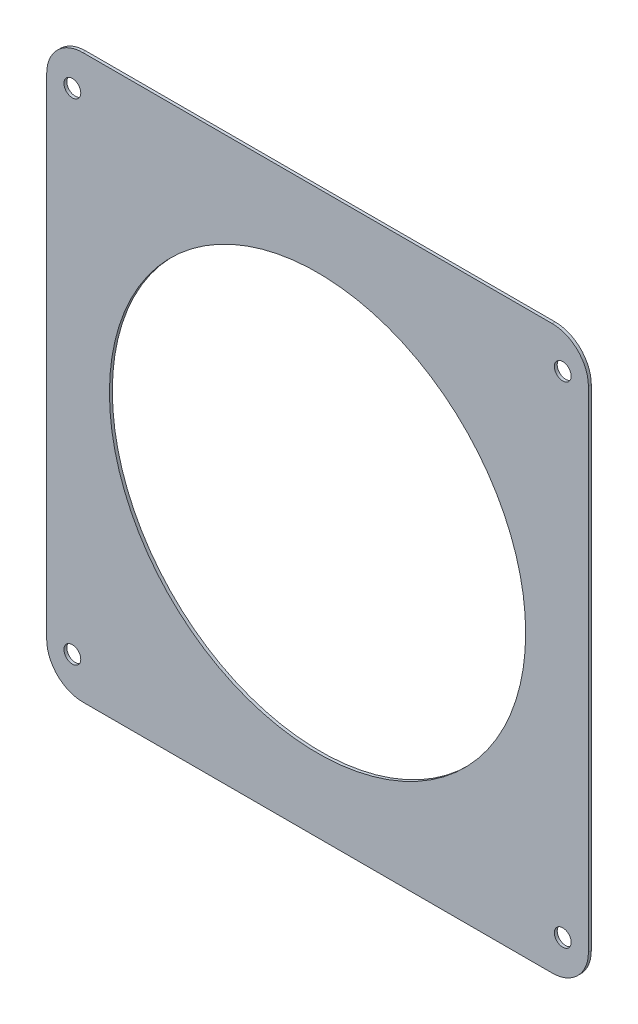
ISO-10303-21;
HEADER;
FILE_DESCRIPTION(('STEP AP214'),'2;1');
FILE_NAME('part.step','',(''),(''),'','','');
FILE_SCHEMA(('AUTOMOTIVE_DESIGN { 1 0 10303 214 1 1 1 1 }'));
ENDSEC;
DATA;
#1=APPLICATION_CONTEXT('core data for automotive mechanical design processes');
#2=APPLICATION_PROTOCOL_DEFINITION('international standard','automotive_design',2000,#1);
#3=PRODUCT_CONTEXT('',#1,'mechanical');
#4=PRODUCT('Part','Part','',(#3));
#5=PRODUCT_RELATED_PRODUCT_CATEGORY('part','',(#4));
#6=PRODUCT_DEFINITION_FORMATION('','',#4);
#7=PRODUCT_DEFINITION_CONTEXT('part definition',#1,'design');
#8=PRODUCT_DEFINITION('design','',#6,#7);
#9=PRODUCT_DEFINITION_SHAPE('','',#8);
#10=(LENGTH_UNIT() NAMED_UNIT(*) SI_UNIT(.MILLI.,.METRE.));
#11=(NAMED_UNIT(*) PLANE_ANGLE_UNIT() SI_UNIT($,.RADIAN.));
#12=(NAMED_UNIT(*) SI_UNIT($,.STERADIAN.) SOLID_ANGLE_UNIT());
#13=UNCERTAINTY_MEASURE_WITH_UNIT(LENGTH_MEASURE(1.E-05),#10,'distance_accuracy_value','');
#14=(GEOMETRIC_REPRESENTATION_CONTEXT(3) GLOBAL_UNCERTAINTY_ASSIGNED_CONTEXT((#13)) GLOBAL_UNIT_ASSIGNED_CONTEXT((#10,
#11,#12)) REPRESENTATION_CONTEXT('',''));
#15=CARTESIAN_POINT('',(0.,0.,0.));
#16=DIRECTION('',(0.,0.,1.));
#17=DIRECTION('',(1.,0.,0.));
#18=AXIS2_PLACEMENT_3D('',#15,#16,#17);
#19=CARTESIAN_POINT('',(47.5,0.,0.508));
#20=DIRECTION('',(1.,0.,0.));
#21=DIRECTION('',(0.,1.,0.));
#22=AXIS2_PLACEMENT_3D('',#19,#20,#21);
#23=PLANE('',#22);
#24=DIRECTION('',(0.,-1.,0.));
#25=VECTOR('',#24,1.);
#26=CARTESIAN_POINT('',(47.5,0.,0.));
#27=LINE('',#26,#25);
#28=CARTESIAN_POINT('',(47.5,42.975,0.));
#29=VERTEX_POINT('',#28);
#30=CARTESIAN_POINT('',(47.5,-42.975,0.));
#31=VERTEX_POINT('',#30);
#32=EDGE_CURVE('E138',#29,#31,#27,.T.);
#33=ORIENTED_EDGE('',*,*,#32,.F.);
#34=DIRECTION('',(0.,0.,-1.));
#35=VECTOR('',#34,1.);
#36=CARTESIAN_POINT('',(47.5,42.975,0.508));
#37=LINE('',#36,#35);
#38=CARTESIAN_POINT('',(47.5,42.975,0.508));
#39=VERTEX_POINT('',#38);
#40=EDGE_CURVE('E11',#29,#39,#37,.F.);
#41=ORIENTED_EDGE('',*,*,#40,.T.);
#42=DIRECTION('',(0.,-1.,0.));
#43=VECTOR('',#42,1.);
#44=CARTESIAN_POINT('',(47.5,0.,0.508));
#45=LINE('',#44,#43);
#46=CARTESIAN_POINT('',(47.5,-42.975,0.508));
#47=VERTEX_POINT('',#46);
#48=EDGE_CURVE('E169',#39,#47,#45,.T.);
#49=ORIENTED_EDGE('',*,*,#48,.T.);
#50=DIRECTION('',(0.,0.,-1.));
#51=VECTOR('',#50,1.);
#52=CARTESIAN_POINT('',(47.5,-42.975,0.));
#53=LINE('',#52,#51);
#54=EDGE_CURVE('E50',#47,#31,#53,.T.);
#55=ORIENTED_EDGE('',*,*,#54,.T.);
#56=EDGE_LOOP('',(#33,#41,#49,#55));
#57=FACE_BOUND('',#56,.T.);
#58=ADVANCED_FACE('F42',(#57),#23,.T.);
#59=CARTESIAN_POINT('',(0.,49.325,0.508));
#60=DIRECTION('',(0.,1.,0.));
#61=DIRECTION('',(-1.,0.,0.));
#62=AXIS2_PLACEMENT_3D('',#59,#60,#61);
#63=PLANE('',#62);
#64=DIRECTION('',(1.,0.,0.));
#65=VECTOR('',#64,1.);
#66=CARTESIAN_POINT('',(0.,49.325,0.));
#67=LINE('',#66,#65);
#68=CARTESIAN_POINT('',(-41.15,49.325,0.));
#69=VERTEX_POINT('',#68);
#70=CARTESIAN_POINT('',(41.15,49.325,0.));
#71=VERTEX_POINT('',#70);
#72=EDGE_CURVE('E134',#69,#71,#67,.T.);
#73=ORIENTED_EDGE('',*,*,#72,.F.);
#74=DIRECTION('',(0.,0.,-1.));
#75=VECTOR('',#74,1.);
#76=CARTESIAN_POINT('',(-41.15,49.325,0.508));
#77=LINE('',#76,#75);
#78=CARTESIAN_POINT('',(-41.15,49.325,0.508));
#79=VERTEX_POINT('',#78);
#80=EDGE_CURVE('E113',#69,#79,#77,.F.);
#81=ORIENTED_EDGE('',*,*,#80,.T.);
#82=DIRECTION('',(1.,0.,0.));
#83=VECTOR('',#82,1.);
#84=CARTESIAN_POINT('',(0.,49.325,0.508));
#85=LINE('',#84,#83);
#86=CARTESIAN_POINT('',(41.15,49.325,0.508));
#87=VERTEX_POINT('',#86);
#88=EDGE_CURVE('E190',#79,#87,#85,.T.);
#89=ORIENTED_EDGE('',*,*,#88,.T.);
#90=DIRECTION('',(0.,0.,-1.));
#91=VECTOR('',#90,1.);
#92=CARTESIAN_POINT('',(41.15,49.325,0.508));
#93=LINE('',#92,#91);
#94=EDGE_CURVE('E118',#87,#71,#93,.T.);
#95=ORIENTED_EDGE('',*,*,#94,.T.);
#96=EDGE_LOOP('',(#73,#81,#89,#95));
#97=FACE_BOUND('',#96,.T.);
#98=ADVANCED_FACE('F228',(#97),#63,.T.);
#99=CARTESIAN_POINT('',(-47.5,0.,0.508));
#100=DIRECTION('',(1.,0.,0.));
#101=DIRECTION('',(0.,1.,0.));
#102=AXIS2_PLACEMENT_3D('',#99,#100,#101);
#103=PLANE('',#102);
#104=DIRECTION('',(0.,-1.,0.));
#105=VECTOR('',#104,1.);
#106=CARTESIAN_POINT('',(-47.5,0.,0.508));
#107=LINE('',#106,#105);
#108=CARTESIAN_POINT('',(-47.5,42.975,0.508));
#109=VERTEX_POINT('',#108);
#110=CARTESIAN_POINT('',(-47.5,-42.975,0.508));
#111=VERTEX_POINT('',#110);
#112=EDGE_CURVE('E127',#109,#111,#107,.T.);
#113=ORIENTED_EDGE('',*,*,#112,.F.);
#114=DIRECTION('',(0.,0.,-1.));
#115=VECTOR('',#114,1.);
#116=CARTESIAN_POINT('',(-47.5,42.975,0.));
#117=LINE('',#116,#115);
#118=CARTESIAN_POINT('',(-47.5,42.975,0.));
#119=VERTEX_POINT('',#118);
#120=EDGE_CURVE('E112',#109,#119,#117,.T.);
#121=ORIENTED_EDGE('',*,*,#120,.T.);
#122=DIRECTION('',(0.,-1.,0.));
#123=VECTOR('',#122,1.);
#124=CARTESIAN_POINT('',(-47.5,0.,0.));
#125=LINE('',#124,#123);
#126=CARTESIAN_POINT('',(-47.5,-42.975,0.));
#127=VERTEX_POINT('',#126);
#128=EDGE_CURVE('E125',#119,#127,#125,.T.);
#129=ORIENTED_EDGE('',*,*,#128,.T.);
#130=DIRECTION('',(0.,0.,-1.));
#131=VECTOR('',#130,1.);
#132=CARTESIAN_POINT('',(-47.5,-42.975,0.508));
#133=LINE('',#132,#131);
#134=EDGE_CURVE('E129',#127,#111,#133,.F.);
#135=ORIENTED_EDGE('',*,*,#134,.T.);
#136=EDGE_LOOP('',(#113,#121,#129,#135));
#137=FACE_BOUND('',#136,.T.);
#138=ADVANCED_FACE('F124',(#137),#103,.F.);
#139=CARTESIAN_POINT('',(0.,0.,0.508));
#140=DIRECTION('',(0.,0.,-1.));
#141=DIRECTION('',(-1.,0.,0.));
#142=AXIS2_PLACEMENT_3D('',#139,#140,#141);
#143=CYLINDRICAL_SURFACE('',#142,36.5);
#144=CARTESIAN_POINT('',(0.,0.,0.508));
#145=DIRECTION('',(0.,0.,1.));
#146=DIRECTION('',(1.,0.,0.));
#147=AXIS2_PLACEMENT_3D('',#144,#145,#146);
#148=CIRCLE('',#147,36.5);
#149=CARTESIAN_POINT('',(36.5,0.,0.508));
#150=VERTEX_POINT('',#149);
#151=EDGE_CURVE('E194',#150,#150,#148,.T.);
#152=ORIENTED_EDGE('',*,*,#151,.T.);
#153=EDGE_LOOP('',(#152));
#154=FACE_BOUND('',#153,.T.);
#155=CARTESIAN_POINT('',(0.,0.,0.));
#156=DIRECTION('',(0.,0.,1.));
#157=DIRECTION('',(1.,0.,0.));
#158=AXIS2_PLACEMENT_3D('',#155,#156,#157);
#159=CIRCLE('',#158,36.5);
#160=CARTESIAN_POINT('',(36.5,0.,0.));
#161=VERTEX_POINT('',#160);
#162=EDGE_CURVE('E172',#161,#161,#159,.T.);
#163=ORIENTED_EDGE('',*,*,#162,.F.);
#164=EDGE_LOOP('',(#163));
#165=FACE_BOUND('',#164,.T.);
#166=ADVANCED_FACE('F244',(#154,#165),#143,.F.);
#167=CARTESIAN_POINT('',(-43.,43.,0.508));
#168=DIRECTION('',(0.,0.,-1.));
#169=DIRECTION('',(-1.,0.,0.));
#170=AXIS2_PLACEMENT_3D('',#167,#168,#169);
#171=CYLINDRICAL_SURFACE('',#170,1.475);
#172=CARTESIAN_POINT('',(-43.,43.,0.508));
#173=DIRECTION('',(0.,0.,1.));
#174=DIRECTION('',(1.,0.,0.));
#175=AXIS2_PLACEMENT_3D('',#172,#173,#174);
#176=CIRCLE('',#175,1.475);
#177=CARTESIAN_POINT('',(-41.525,43.,0.508));
#178=VERTEX_POINT('',#177);
#179=EDGE_CURVE('E197',#178,#178,#176,.T.);
#180=ORIENTED_EDGE('',*,*,#179,.T.);
#181=EDGE_LOOP('',(#180));
#182=FACE_BOUND('',#181,.T.);
#183=CARTESIAN_POINT('',(-43.,43.,0.));
#184=DIRECTION('',(0.,0.,1.));
#185=DIRECTION('',(1.,0.,0.));
#186=AXIS2_PLACEMENT_3D('',#183,#184,#185);
#187=CIRCLE('',#186,1.475);
#188=CARTESIAN_POINT('',(-41.525,43.,0.));
#189=VERTEX_POINT('',#188);
#190=EDGE_CURVE('E174',#189,#189,#187,.T.);
#191=ORIENTED_EDGE('',*,*,#190,.F.);
#192=EDGE_LOOP('',(#191));
#193=FACE_BOUND('',#192,.T.);
#194=ADVANCED_FACE('F247',(#182,#193),#171,.F.);
#195=CARTESIAN_POINT('',(43.,43.,0.508));
#196=DIRECTION('',(0.,0.,-1.));
#197=DIRECTION('',(-1.,0.,0.));
#198=AXIS2_PLACEMENT_3D('',#195,#196,#197);
#199=CYLINDRICAL_SURFACE('',#198,1.475);
#200=CARTESIAN_POINT('',(43.,43.,0.508));
#201=DIRECTION('',(0.,0.,1.));
#202=DIRECTION('',(1.,0.,0.));
#203=AXIS2_PLACEMENT_3D('',#200,#201,#202);
#204=CIRCLE('',#203,1.475);
#205=CARTESIAN_POINT('',(44.475,43.,0.508));
#206=VERTEX_POINT('',#205);
#207=EDGE_CURVE('E200',#206,#206,#204,.T.);
#208=ORIENTED_EDGE('',*,*,#207,.T.);
#209=EDGE_LOOP('',(#208));
#210=FACE_BOUND('',#209,.T.);
#211=CARTESIAN_POINT('',(43.,43.,0.));
#212=DIRECTION('',(0.,0.,1.));
#213=DIRECTION('',(1.,0.,0.));
#214=AXIS2_PLACEMENT_3D('',#211,#212,#213);
#215=CIRCLE('',#214,1.475);
#216=CARTESIAN_POINT('',(44.475,43.,0.));
#217=VERTEX_POINT('',#216);
#218=EDGE_CURVE('E179',#217,#217,#215,.T.);
#219=ORIENTED_EDGE('',*,*,#218,.F.);
#220=EDGE_LOOP('',(#219));
#221=FACE_BOUND('',#220,.T.);
#222=ADVANCED_FACE('F251',(#210,#221),#199,.F.);
#223=CARTESIAN_POINT('',(43.,-43.,0.508));
#224=DIRECTION('',(0.,0.,-1.));
#225=DIRECTION('',(-1.,0.,0.));
#226=AXIS2_PLACEMENT_3D('',#223,#224,#225);
#227=CYLINDRICAL_SURFACE('',#226,1.475);
#228=CARTESIAN_POINT('',(43.,-43.,0.508));
#229=DIRECTION('',(0.,0.,1.));
#230=DIRECTION('',(1.,0.,0.));
#231=AXIS2_PLACEMENT_3D('',#228,#229,#230);
#232=CIRCLE('',#231,1.475);
#233=CARTESIAN_POINT('',(44.475,-43.,0.508));
#234=VERTEX_POINT('',#233);
#235=EDGE_CURVE('E203',#234,#234,#232,.T.);
#236=ORIENTED_EDGE('',*,*,#235,.T.);
#237=EDGE_LOOP('',(#236));
#238=FACE_BOUND('',#237,.T.);
#239=CARTESIAN_POINT('',(43.,-43.,0.));
#240=DIRECTION('',(0.,0.,1.));
#241=DIRECTION('',(1.,0.,0.));
#242=AXIS2_PLACEMENT_3D('',#239,#240,#241);
#243=CIRCLE('',#242,1.475);
#244=CARTESIAN_POINT('',(44.475,-43.,0.));
#245=VERTEX_POINT('',#244);
#246=EDGE_CURVE('E182',#245,#245,#243,.T.);
#247=ORIENTED_EDGE('',*,*,#246,.F.);
#248=EDGE_LOOP('',(#247));
#249=FACE_BOUND('',#248,.T.);
#250=ADVANCED_FACE('F255',(#238,#249),#227,.F.);
#251=CARTESIAN_POINT('',(-43.,-43.,0.508));
#252=DIRECTION('',(0.,0.,-1.));
#253=DIRECTION('',(-1.,0.,0.));
#254=AXIS2_PLACEMENT_3D('',#251,#252,#253);
#255=CYLINDRICAL_SURFACE('',#254,1.475);
#256=CARTESIAN_POINT('',(-43.,-43.,0.508));
#257=DIRECTION('',(0.,0.,1.));
#258=DIRECTION('',(1.,0.,0.));
#259=AXIS2_PLACEMENT_3D('',#256,#257,#258);
#260=CIRCLE('',#259,1.475);
#261=CARTESIAN_POINT('',(-41.525,-43.,0.508));
#262=VERTEX_POINT('',#261);
#263=EDGE_CURVE('E136',#262,#262,#260,.T.);
#264=ORIENTED_EDGE('',*,*,#263,.T.);
#265=EDGE_LOOP('',(#264));
#266=FACE_BOUND('',#265,.T.);
#267=CARTESIAN_POINT('',(-43.,-43.,0.));
#268=DIRECTION('',(0.,0.,1.));
#269=DIRECTION('',(1.,0.,0.));
#270=AXIS2_PLACEMENT_3D('',#267,#268,#269);
#271=CIRCLE('',#270,1.475);
#272=CARTESIAN_POINT('',(-41.525,-43.,0.));
#273=VERTEX_POINT('',#272);
#274=EDGE_CURVE('E185',#273,#273,#271,.T.);
#275=ORIENTED_EDGE('',*,*,#274,.F.);
#276=EDGE_LOOP('',(#275));
#277=FACE_BOUND('',#276,.T.);
#278=ADVANCED_FACE('F209',(#266,#277),#255,.F.);
#279=CARTESIAN_POINT('',(0.,-49.325,0.508));
#280=DIRECTION('',(0.,1.,0.));
#281=DIRECTION('',(-1.,0.,0.));
#282=AXIS2_PLACEMENT_3D('',#279,#280,#281);
#283=PLANE('',#282);
#284=DIRECTION('',(1.,0.,0.));
#285=VECTOR('',#284,1.);
#286=CARTESIAN_POINT('',(0.,-49.325,0.508));
#287=LINE('',#286,#285);
#288=CARTESIAN_POINT('',(-41.15,-49.325,0.508));
#289=VERTEX_POINT('',#288);
#290=CARTESIAN_POINT('',(41.15,-49.325,0.508));
#291=VERTEX_POINT('',#290);
#292=EDGE_CURVE('E142',#289,#291,#287,.T.);
#293=ORIENTED_EDGE('',*,*,#292,.F.);
#294=DIRECTION('',(0.,0.,-1.));
#295=VECTOR('',#294,1.);
#296=CARTESIAN_POINT('',(-41.15,-49.325,0.508));
#297=LINE('',#296,#295);
#298=CARTESIAN_POINT('',(-41.15,-49.325,0.));
#299=VERTEX_POINT('',#298);
#300=EDGE_CURVE('E159',#289,#299,#297,.T.);
#301=ORIENTED_EDGE('',*,*,#300,.T.);
#302=DIRECTION('',(1.,0.,0.));
#303=VECTOR('',#302,1.);
#304=CARTESIAN_POINT('',(0.,-49.325,0.));
#305=LINE('',#304,#303);
#306=CARTESIAN_POINT('',(41.15,-49.325,0.));
#307=VERTEX_POINT('',#306);
#308=EDGE_CURVE('E133',#299,#307,#305,.T.);
#309=ORIENTED_EDGE('',*,*,#308,.T.);
#310=DIRECTION('',(0.,0.,-1.));
#311=VECTOR('',#310,1.);
#312=CARTESIAN_POINT('',(41.15,-49.325,0.508));
#313=LINE('',#312,#311);
#314=EDGE_CURVE('E57',#307,#291,#313,.F.);
#315=ORIENTED_EDGE('',*,*,#314,.T.);
#316=EDGE_LOOP('',(#293,#301,#309,#315));
#317=FACE_BOUND('',#316,.T.);
#318=ADVANCED_FACE('F215',(#317),#283,.F.);
#319=CARTESIAN_POINT('',(0.,0.,0.508));
#320=DIRECTION('',(0.,0.,1.));
#321=DIRECTION('',(1.,0.,0.));
#322=AXIS2_PLACEMENT_3D('',#319,#320,#321);
#323=PLANE('',#322);
#324=ORIENTED_EDGE('',*,*,#263,.F.);
#325=EDGE_LOOP('',(#324));
#326=FACE_BOUND('',#325,.T.);
#327=ORIENTED_EDGE('',*,*,#235,.F.);
#328=EDGE_LOOP('',(#327));
#329=FACE_BOUND('',#328,.T.);
#330=ORIENTED_EDGE('',*,*,#207,.F.);
#331=EDGE_LOOP('',(#330));
#332=FACE_BOUND('',#331,.T.);
#333=ORIENTED_EDGE('',*,*,#179,.F.);
#334=EDGE_LOOP('',(#333));
#335=FACE_BOUND('',#334,.T.);
#336=ORIENTED_EDGE('',*,*,#151,.F.);
#337=EDGE_LOOP('',(#336));
#338=FACE_BOUND('',#337,.T.);
#339=ORIENTED_EDGE('',*,*,#88,.F.);
#340=CARTESIAN_POINT('',(-41.15,42.975,0.508));
#341=DIRECTION('',(0.,0.,1.));
#342=DIRECTION('',(1.,0.,0.));
#343=AXIS2_PLACEMENT_3D('',#340,#341,#342);
#344=CIRCLE('',#343,6.35);
#345=EDGE_CURVE('E156',#79,#109,#344,.T.);
#346=ORIENTED_EDGE('',*,*,#345,.T.);
#347=ORIENTED_EDGE('',*,*,#112,.T.);
#348=CARTESIAN_POINT('',(-41.15,-42.975,0.508));
#349=DIRECTION('',(0.,0.,1.));
#350=DIRECTION('',(1.,0.,0.));
#351=AXIS2_PLACEMENT_3D('',#348,#349,#350);
#352=CIRCLE('',#351,6.35);
#353=EDGE_CURVE('E64',#111,#289,#352,.T.);
#354=ORIENTED_EDGE('',*,*,#353,.T.);
#355=ORIENTED_EDGE('',*,*,#292,.T.);
#356=CARTESIAN_POINT('',(41.15,-42.975,0.508));
#357=DIRECTION('',(0.,0.,1.));
#358=DIRECTION('',(1.,0.,0.));
#359=AXIS2_PLACEMENT_3D('',#356,#357,#358);
#360=CIRCLE('',#359,6.35);
#361=EDGE_CURVE('E151',#291,#47,#360,.T.);
#362=ORIENTED_EDGE('',*,*,#361,.T.);
#363=ORIENTED_EDGE('',*,*,#48,.F.);
#364=CARTESIAN_POINT('',(41.15,42.975,0.508));
#365=DIRECTION('',(0.,0.,1.));
#366=DIRECTION('',(1.,0.,0.));
#367=AXIS2_PLACEMENT_3D('',#364,#365,#366);
#368=CIRCLE('',#367,6.35);
#369=EDGE_CURVE('E153',#39,#87,#368,.T.);
#370=ORIENTED_EDGE('',*,*,#369,.T.);
#371=EDGE_LOOP('',(#339,#346,#347,#354,#355,#362,#363,#370));
#372=FACE_BOUND('',#371,.T.);
#373=ADVANCED_FACE('F212',(#326,#329,#332,#335,#338,#372),#323,.T.);
#374=CARTESIAN_POINT('',(0.,0.,0.));
#375=DIRECTION('',(0.,0.,1.));
#376=DIRECTION('',(1.,0.,0.));
#377=AXIS2_PLACEMENT_3D('',#374,#375,#376);
#378=PLANE('',#377);
#379=ORIENTED_EDGE('',*,*,#274,.T.);
#380=EDGE_LOOP('',(#379));
#381=FACE_BOUND('',#380,.T.);
#382=ORIENTED_EDGE('',*,*,#246,.T.);
#383=EDGE_LOOP('',(#382));
#384=FACE_BOUND('',#383,.T.);
#385=ORIENTED_EDGE('',*,*,#218,.T.);
#386=EDGE_LOOP('',(#385));
#387=FACE_BOUND('',#386,.T.);
#388=ORIENTED_EDGE('',*,*,#190,.T.);
#389=EDGE_LOOP('',(#388));
#390=FACE_BOUND('',#389,.T.);
#391=ORIENTED_EDGE('',*,*,#162,.T.);
#392=EDGE_LOOP('',(#391));
#393=FACE_BOUND('',#392,.T.);
#394=ORIENTED_EDGE('',*,*,#128,.F.);
#395=CARTESIAN_POINT('',(-41.15,42.975,0.));
#396=DIRECTION('',(0.,0.,1.));
#397=DIRECTION('',(1.,0.,0.));
#398=AXIS2_PLACEMENT_3D('',#395,#396,#397);
#399=CIRCLE('',#398,6.35);
#400=EDGE_CURVE('E108',#119,#69,#399,.F.);
#401=ORIENTED_EDGE('',*,*,#400,.T.);
#402=ORIENTED_EDGE('',*,*,#72,.T.);
#403=CARTESIAN_POINT('',(41.15,42.975,0.));
#404=DIRECTION('',(0.,0.,1.));
#405=DIRECTION('',(1.,0.,0.));
#406=AXIS2_PLACEMENT_3D('',#403,#404,#405);
#407=CIRCLE('',#406,6.35);
#408=EDGE_CURVE('E145',#71,#29,#407,.F.);
#409=ORIENTED_EDGE('',*,*,#408,.T.);
#410=ORIENTED_EDGE('',*,*,#32,.T.);
#411=CARTESIAN_POINT('',(41.15,-42.975,0.));
#412=DIRECTION('',(0.,0.,1.));
#413=DIRECTION('',(1.,0.,0.));
#414=AXIS2_PLACEMENT_3D('',#411,#412,#413);
#415=CIRCLE('',#414,6.35);
#416=EDGE_CURVE('E128',#31,#307,#415,.F.);
#417=ORIENTED_EDGE('',*,*,#416,.T.);
#418=ORIENTED_EDGE('',*,*,#308,.F.);
#419=CARTESIAN_POINT('',(-41.15,-42.975,0.));
#420=DIRECTION('',(0.,0.,1.));
#421=DIRECTION('',(1.,0.,0.));
#422=AXIS2_PLACEMENT_3D('',#419,#420,#421);
#423=CIRCLE('',#422,6.35);
#424=EDGE_CURVE('E119',#299,#127,#423,.F.);
#425=ORIENTED_EDGE('',*,*,#424,.T.);
#426=EDGE_LOOP('',(#394,#401,#402,#409,#410,#417,#418,#425));
#427=FACE_BOUND('',#426,.T.);
#428=ADVANCED_FACE('F131',(#381,#384,#387,#390,#393,#427),#378,.F.);
#429=CARTESIAN_POINT('',(-41.15,42.975,0.508));
#430=DIRECTION('',(0.,0.,1.));
#431=DIRECTION('',(1.,0.,0.));
#432=AXIS2_PLACEMENT_3D('',#429,#430,#431);
#433=CYLINDRICAL_SURFACE('',#432,6.35);
#434=ORIENTED_EDGE('',*,*,#345,.F.);
#435=ORIENTED_EDGE('',*,*,#80,.F.);
#436=ORIENTED_EDGE('',*,*,#400,.F.);
#437=ORIENTED_EDGE('',*,*,#120,.F.);
#438=EDGE_LOOP('',(#434,#435,#436,#437));
#439=FACE_BOUND('',#438,.T.);
#440=ADVANCED_FACE('F111',(#439),#433,.T.);
#441=CARTESIAN_POINT('',(-41.15,-42.975,0.508));
#442=DIRECTION('',(0.,0.,-1.));
#443=DIRECTION('',(-1.,0.,0.));
#444=AXIS2_PLACEMENT_3D('',#441,#442,#443);
#445=CYLINDRICAL_SURFACE('',#444,6.35);
#446=ORIENTED_EDGE('',*,*,#353,.F.);
#447=ORIENTED_EDGE('',*,*,#134,.F.);
#448=ORIENTED_EDGE('',*,*,#424,.F.);
#449=ORIENTED_EDGE('',*,*,#300,.F.);
#450=EDGE_LOOP('',(#446,#447,#448,#449));
#451=FACE_BOUND('',#450,.T.);
#452=ADVANCED_FACE('F235',(#451),#445,.T.);
#453=CARTESIAN_POINT('',(41.15,42.975,0.508));
#454=DIRECTION('',(0.,0.,-1.));
#455=DIRECTION('',(-1.,0.,0.));
#456=AXIS2_PLACEMENT_3D('',#453,#454,#455);
#457=CYLINDRICAL_SURFACE('',#456,6.35);
#458=ORIENTED_EDGE('',*,*,#369,.F.);
#459=ORIENTED_EDGE('',*,*,#40,.F.);
#460=ORIENTED_EDGE('',*,*,#408,.F.);
#461=ORIENTED_EDGE('',*,*,#94,.F.);
#462=EDGE_LOOP('',(#458,#459,#460,#461));
#463=FACE_BOUND('',#462,.T.);
#464=ADVANCED_FACE('F230',(#463),#457,.T.);
#465=CARTESIAN_POINT('',(41.15,-42.975,0.508));
#466=DIRECTION('',(0.,0.,1.));
#467=DIRECTION('',(1.,0.,0.));
#468=AXIS2_PLACEMENT_3D('',#465,#466,#467);
#469=CYLINDRICAL_SURFACE('',#468,6.35);
#470=ORIENTED_EDGE('',*,*,#361,.F.);
#471=ORIENTED_EDGE('',*,*,#314,.F.);
#472=ORIENTED_EDGE('',*,*,#416,.F.);
#473=ORIENTED_EDGE('',*,*,#54,.F.);
#474=EDGE_LOOP('',(#470,#471,#472,#473));
#475=FACE_BOUND('',#474,.T.);
#476=ADVANCED_FACE('F44',(#475),#469,.T.);
#477=CLOSED_SHELL('',(#58,#98,#138,#166,#194,#222,#250,#278,#318,#373,#428,#440,#452,#464,#476));
#478=MANIFOLD_SOLID_BREP('B2',#477);
#479=ADVANCED_BREP_SHAPE_REPRESENTATION('',(#18,#478),#14);
#480=SHAPE_DEFINITION_REPRESENTATION(#9,#479);
ENDSEC;
END-ISO-10303-21;
